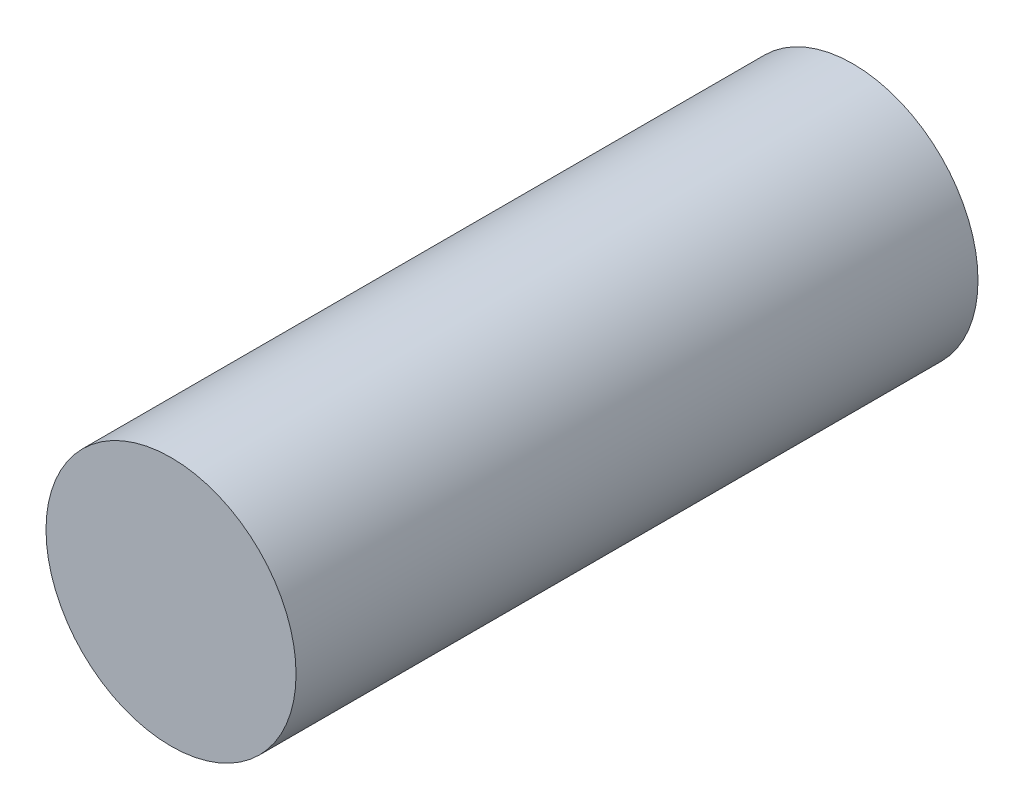
ISO-10303-21;
HEADER;
FILE_DESCRIPTION(('STEP AP214'),'2;1');
FILE_NAME('part.step','',(''),(''),'','','');
FILE_SCHEMA(('AUTOMOTIVE_DESIGN { 1 0 10303 214 1 1 1 1 }'));
ENDSEC;
DATA;
#1=APPLICATION_CONTEXT('core data for automotive mechanical design processes');
#2=APPLICATION_PROTOCOL_DEFINITION('international standard','automotive_design',2000,#1);
#3=PRODUCT_CONTEXT('',#1,'mechanical');
#4=PRODUCT('Part','Part','',(#3));
#5=PRODUCT_RELATED_PRODUCT_CATEGORY('part','',(#4));
#6=PRODUCT_DEFINITION_FORMATION('','',#4);
#7=PRODUCT_DEFINITION_CONTEXT('part definition',#1,'design');
#8=PRODUCT_DEFINITION('design','',#6,#7);
#9=PRODUCT_DEFINITION_SHAPE('','',#8);
#10=(LENGTH_UNIT() NAMED_UNIT(*) SI_UNIT(.MILLI.,.METRE.));
#11=(NAMED_UNIT(*) PLANE_ANGLE_UNIT() SI_UNIT($,.RADIAN.));
#12=(NAMED_UNIT(*) SI_UNIT($,.STERADIAN.) SOLID_ANGLE_UNIT());
#13=UNCERTAINTY_MEASURE_WITH_UNIT(LENGTH_MEASURE(1.E-05),#10,'distance_accuracy_value','');
#14=(GEOMETRIC_REPRESENTATION_CONTEXT(3) GLOBAL_UNCERTAINTY_ASSIGNED_CONTEXT((#13)) GLOBAL_UNIT_ASSIGNED_CONTEXT((#10,
#11,#12)) REPRESENTATION_CONTEXT('',''));
#15=CARTESIAN_POINT('',(0.,0.,0.));
#16=DIRECTION('',(0.,0.,1.));
#17=DIRECTION('',(1.,0.,0.));
#18=AXIS2_PLACEMENT_3D('',#15,#16,#17);
#19=CARTESIAN_POINT('',(0.,0.,15.));
#20=DIRECTION('',(0.,0.,-1.));
#21=DIRECTION('',(-1.,0.,0.));
#22=AXIS2_PLACEMENT_3D('',#19,#20,#21);
#23=CYLINDRICAL_SURFACE('',#22,5.5);
#24=CARTESIAN_POINT('',(0.,0.,15.));
#25=DIRECTION('',(0.,0.,1.));
#26=DIRECTION('',(1.,0.,0.));
#27=AXIS2_PLACEMENT_3D('',#24,#25,#26);
#28=CIRCLE('',#27,5.5);
#29=CARTESIAN_POINT('',(5.5,0.,15.));
#30=VERTEX_POINT('',#29);
#31=EDGE_CURVE('E10',#30,#30,#28,.T.);
#32=ORIENTED_EDGE('',*,*,#31,.F.);
#33=EDGE_LOOP('',(#32));
#34=FACE_BOUND('',#33,.T.);
#35=CARTESIAN_POINT('',(0.,0.,-15.));
#36=DIRECTION('',(0.,0.,1.));
#37=DIRECTION('',(1.,0.,0.));
#38=AXIS2_PLACEMENT_3D('',#35,#36,#37);
#39=CIRCLE('',#38,5.5);
#40=CARTESIAN_POINT('',(5.5,0.,-15.));
#41=VERTEX_POINT('',#40);
#42=EDGE_CURVE('E46',#41,#41,#39,.T.);
#43=ORIENTED_EDGE('',*,*,#42,.T.);
#44=EDGE_LOOP('',(#43));
#45=FACE_BOUND('',#44,.T.);
#46=ADVANCED_FACE('F43',(#34,#45),#23,.T.);
#47=CARTESIAN_POINT('',(0.,0.,15.));
#48=DIRECTION('',(0.,0.,1.));
#49=DIRECTION('',(1.,0.,0.));
#50=AXIS2_PLACEMENT_3D('',#47,#48,#49);
#51=PLANE('',#50);
#52=ORIENTED_EDGE('',*,*,#31,.T.);
#53=EDGE_LOOP('',(#52));
#54=FACE_BOUND('',#53,.T.);
#55=ADVANCED_FACE('F58',(#54),#51,.T.);
#56=CARTESIAN_POINT('',(0.,0.,-15.));
#57=DIRECTION('',(0.,0.,1.));
#58=DIRECTION('',(1.,0.,0.));
#59=AXIS2_PLACEMENT_3D('',#56,#57,#58);
#60=PLANE('',#59);
#61=ORIENTED_EDGE('',*,*,#42,.F.);
#62=EDGE_LOOP('',(#61));
#63=FACE_BOUND('',#62,.T.);
#64=ADVANCED_FACE('F59',(#63),#60,.F.);
#65=CLOSED_SHELL('',(#46,#55,#64));
#66=MANIFOLD_SOLID_BREP('B2',#65);
#67=ADVANCED_BREP_SHAPE_REPRESENTATION('',(#18,#66),#14);
#68=SHAPE_DEFINITION_REPRESENTATION(#9,#67);
ENDSEC;
END-ISO-10303-21;
